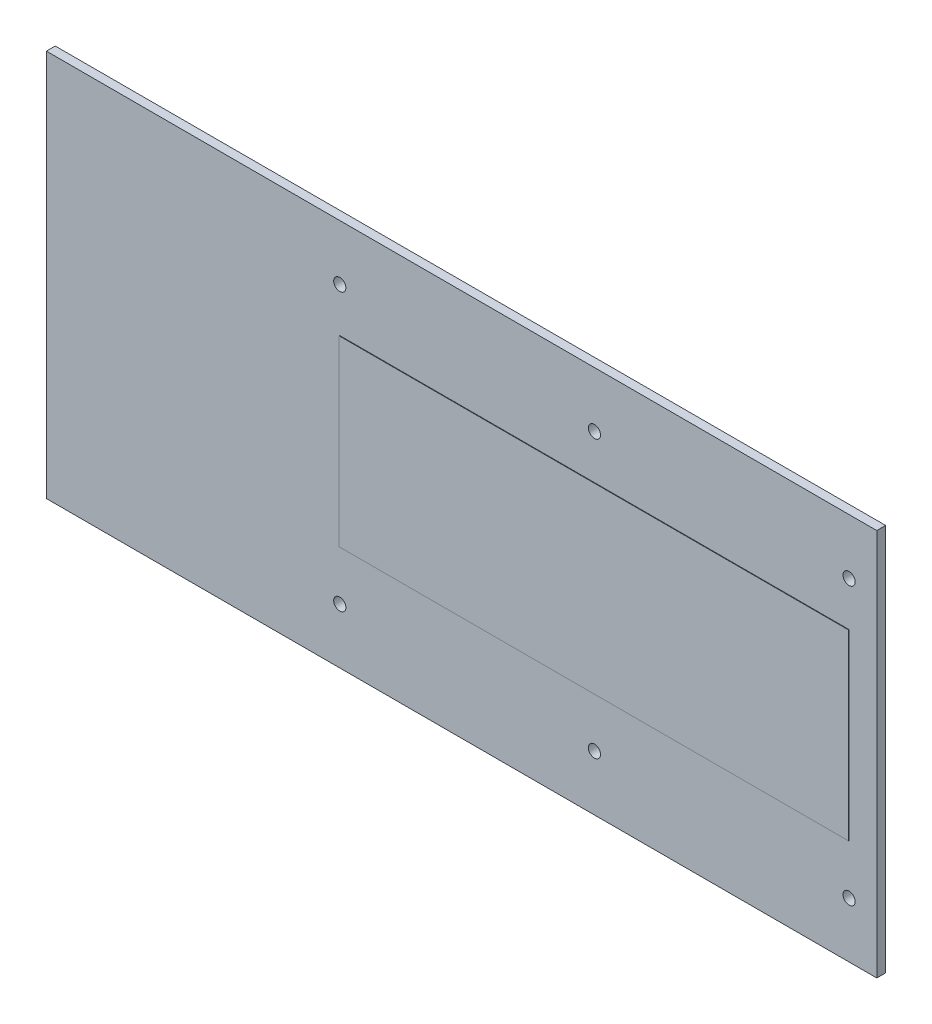
ISO-10303-21;
HEADER;
FILE_DESCRIPTION(('STEP AP214'),'2;1');
FILE_NAME('part.step','',(''),(''),'','','');
FILE_SCHEMA(('AUTOMOTIVE_DESIGN { 1 0 10303 214 1 1 1 1 }'));
ENDSEC;
DATA;
#1=APPLICATION_CONTEXT('core data for automotive mechanical design processes');
#2=APPLICATION_PROTOCOL_DEFINITION('international standard','automotive_design',2000,#1);
#3=PRODUCT_CONTEXT('',#1,'mechanical');
#4=PRODUCT('Part','Part','',(#3));
#5=PRODUCT_RELATED_PRODUCT_CATEGORY('part','',(#4));
#6=PRODUCT_DEFINITION_FORMATION('','',#4);
#7=PRODUCT_DEFINITION_CONTEXT('part definition',#1,'design');
#8=PRODUCT_DEFINITION('design','',#6,#7);
#9=PRODUCT_DEFINITION_SHAPE('','',#8);
#10=(LENGTH_UNIT() NAMED_UNIT(*) SI_UNIT(.MILLI.,.METRE.));
#11=(NAMED_UNIT(*) PLANE_ANGLE_UNIT() SI_UNIT($,.RADIAN.));
#12=(NAMED_UNIT(*) SI_UNIT($,.STERADIAN.) SOLID_ANGLE_UNIT());
#13=UNCERTAINTY_MEASURE_WITH_UNIT(LENGTH_MEASURE(1.E-05),#10,'distance_accuracy_value','');
#14=(GEOMETRIC_REPRESENTATION_CONTEXT(3) GLOBAL_UNCERTAINTY_ASSIGNED_CONTEXT((#13)) GLOBAL_UNIT_ASSIGNED_CONTEXT((#10,
#11,#12)) REPRESENTATION_CONTEXT('',''));
#15=CARTESIAN_POINT('',(0.,0.,0.));
#16=DIRECTION('',(0.,0.,1.));
#17=DIRECTION('',(1.,0.,0.));
#18=AXIS2_PLACEMENT_3D('',#15,#16,#17);
#19=CARTESIAN_POINT('',(53.,52.,1.7));
#20=DIRECTION('',(1.,0.,0.));
#21=DIRECTION('',(0.,0.,-1.));
#22=AXIS2_PLACEMENT_3D('',#19,#20,#21);
#23=PLANE('',#22);
#24=DIRECTION('',(0.,-1.,0.));
#25=VECTOR('',#24,1.);
#26=CARTESIAN_POINT('',(53.,52.,1.6));
#27=LINE('',#26,#25);
#28=CARTESIAN_POINT('',(53.,52.,1.6));
#29=VERTEX_POINT('',#28);
#30=CARTESIAN_POINT('',(53.,19.,1.6));
#31=VERTEX_POINT('',#30);
#32=EDGE_CURVE('E107',#29,#31,#27,.T.);
#33=ORIENTED_EDGE('',*,*,#32,.T.);
#34=DIRECTION('',(0.,0.,-1.));
#35=VECTOR('',#34,1.);
#36=CARTESIAN_POINT('',(53.,19.,1.7));
#37=LINE('',#36,#35);
#38=CARTESIAN_POINT('',(53.,19.,1.7));
#39=VERTEX_POINT('',#38);
#40=EDGE_CURVE('E12',#39,#31,#37,.T.);
#41=ORIENTED_EDGE('',*,*,#40,.F.);
#42=DIRECTION('',(0.,-1.,0.));
#43=VECTOR('',#42,1.);
#44=CARTESIAN_POINT('',(53.,52.,1.7));
#45=LINE('',#44,#43);
#46=CARTESIAN_POINT('',(53.,52.,1.7));
#47=VERTEX_POINT('',#46);
#48=EDGE_CURVE('E95',#47,#39,#45,.T.);
#49=ORIENTED_EDGE('',*,*,#48,.F.);
#50=DIRECTION('',(0.,0.,-1.));
#51=VECTOR('',#50,1.);
#52=CARTESIAN_POINT('',(53.,52.,1.7));
#53=LINE('',#52,#51);
#54=EDGE_CURVE('E103',#47,#29,#53,.T.);
#55=ORIENTED_EDGE('',*,*,#54,.T.);
#56=EDGE_LOOP('',(#33,#41,#49,#55));
#57=FACE_BOUND('',#56,.T.);
#58=ADVANCED_FACE('F44',(#57),#23,.F.);
#59=CARTESIAN_POINT('',(53.,19.,1.7));
#60=DIRECTION('',(0.,1.,0.));
#61=DIRECTION('',(0.,0.,1.));
#62=AXIS2_PLACEMENT_3D('',#59,#60,#61);
#63=PLANE('',#62);
#64=DIRECTION('',(1.,0.,0.));
#65=VECTOR('',#64,1.);
#66=CARTESIAN_POINT('',(53.,19.,1.6));
#67=LINE('',#66,#65);
#68=CARTESIAN_POINT('',(145.,19.,1.6));
#69=VERTEX_POINT('',#68);
#70=EDGE_CURVE('E99',#31,#69,#67,.T.);
#71=ORIENTED_EDGE('',*,*,#70,.T.);
#72=DIRECTION('',(0.,0.,-1.));
#73=VECTOR('',#72,1.);
#74=CARTESIAN_POINT('',(145.,19.,1.7));
#75=LINE('',#74,#73);
#76=CARTESIAN_POINT('',(145.,19.,1.7));
#77=VERTEX_POINT('',#76);
#78=EDGE_CURVE('E52',#77,#69,#75,.T.);
#79=ORIENTED_EDGE('',*,*,#78,.F.);
#80=DIRECTION('',(1.,0.,0.));
#81=VECTOR('',#80,1.);
#82=CARTESIAN_POINT('',(53.,19.,1.7));
#83=LINE('',#82,#81);
#84=EDGE_CURVE('E90',#39,#77,#83,.T.);
#85=ORIENTED_EDGE('',*,*,#84,.F.);
#86=ORIENTED_EDGE('',*,*,#40,.T.);
#87=EDGE_LOOP('',(#71,#79,#85,#86));
#88=FACE_BOUND('',#87,.T.);
#89=ADVANCED_FACE('F98',(#88),#63,.F.);
#90=CARTESIAN_POINT('',(145.,52.,1.7));
#91=DIRECTION('',(-1.,0.,0.));
#92=DIRECTION('',(0.,0.,1.));
#93=AXIS2_PLACEMENT_3D('',#90,#91,#92);
#94=PLANE('',#93);
#95=DIRECTION('',(0.,1.,0.));
#96=VECTOR('',#95,1.);
#97=CARTESIAN_POINT('',(145.,52.,1.6));
#98=LINE('',#97,#96);
#99=CARTESIAN_POINT('',(145.,52.,1.6));
#100=VERTEX_POINT('',#99);
#101=EDGE_CURVE('E77',#69,#100,#98,.T.);
#102=ORIENTED_EDGE('',*,*,#101,.T.);
#103=DIRECTION('',(0.,0.,-1.));
#104=VECTOR('',#103,1.);
#105=CARTESIAN_POINT('',(145.,52.,1.7));
#106=LINE('',#105,#104);
#107=CARTESIAN_POINT('',(145.,52.,1.7));
#108=VERTEX_POINT('',#107);
#109=EDGE_CURVE('E100',#108,#100,#106,.T.);
#110=ORIENTED_EDGE('',*,*,#109,.F.);
#111=DIRECTION('',(0.,1.,0.));
#112=VECTOR('',#111,1.);
#113=CARTESIAN_POINT('',(145.,52.,1.7));
#114=LINE('',#113,#112);
#115=EDGE_CURVE('E93',#77,#108,#114,.T.);
#116=ORIENTED_EDGE('',*,*,#115,.F.);
#117=ORIENTED_EDGE('',*,*,#78,.T.);
#118=EDGE_LOOP('',(#102,#110,#116,#117));
#119=FACE_BOUND('',#118,.T.);
#120=ADVANCED_FACE('F101',(#119),#94,.F.);
#121=CARTESIAN_POINT('',(53.,52.,1.7));
#122=DIRECTION('',(0.,-1.,0.));
#123=DIRECTION('',(0.,0.,-1.));
#124=AXIS2_PLACEMENT_3D('',#121,#122,#123);
#125=PLANE('',#124);
#126=DIRECTION('',(-1.,0.,0.));
#127=VECTOR('',#126,1.);
#128=CARTESIAN_POINT('',(53.,52.,1.6));
#129=LINE('',#128,#127);
#130=EDGE_CURVE('E83',#100,#29,#129,.T.);
#131=ORIENTED_EDGE('',*,*,#130,.T.);
#132=ORIENTED_EDGE('',*,*,#54,.F.);
#133=DIRECTION('',(-1.,0.,0.));
#134=VECTOR('',#133,1.);
#135=CARTESIAN_POINT('',(53.,52.,1.7));
#136=LINE('',#135,#134);
#137=EDGE_CURVE('E60',#108,#47,#136,.T.);
#138=ORIENTED_EDGE('',*,*,#137,.F.);
#139=ORIENTED_EDGE('',*,*,#109,.T.);
#140=EDGE_LOOP('',(#131,#132,#138,#139));
#141=FACE_BOUND('',#140,.T.);
#142=ADVANCED_FACE('F114',(#141),#125,.F.);
#143=CARTESIAN_POINT('',(0.,0.,1.7));
#144=DIRECTION('',(0.,0.,1.));
#145=DIRECTION('',(1.,0.,0.));
#146=AXIS2_PLACEMENT_3D('',#143,#144,#145);
#147=PLANE('',#146);
#148=ORIENTED_EDGE('',*,*,#48,.T.);
#149=ORIENTED_EDGE('',*,*,#84,.T.);
#150=ORIENTED_EDGE('',*,*,#115,.T.);
#151=ORIENTED_EDGE('',*,*,#137,.T.);
#152=EDGE_LOOP('',(#148,#149,#150,#151));
#153=FACE_BOUND('',#152,.T.);
#154=ADVANCED_FACE('F91',(#153),#147,.T.);
#155=CARTESIAN_POINT('',(0.,0.,1.6));
#156=DIRECTION('',(0.,0.,1.));
#157=DIRECTION('',(1.,0.,0.));
#158=AXIS2_PLACEMENT_3D('',#155,#156,#157);
#159=PLANE('',#158);
#160=ORIENTED_EDGE('',*,*,#32,.F.);
#161=ORIENTED_EDGE('',*,*,#130,.F.);
#162=ORIENTED_EDGE('',*,*,#101,.F.);
#163=ORIENTED_EDGE('',*,*,#70,.F.);
#164=EDGE_LOOP('',(#160,#161,#162,#163));
#165=FACE_BOUND('',#164,.T.);
#166=ADVANCED_FACE('F117',(#165),#159,.F.);
#167=CLOSED_SHELL('',(#58,#89,#120,#142,#154,#166));
#168=MANIFOLD_SOLID_BREP('B2',#167);
#169=CARTESIAN_POINT('',(0.,0.,1.6));
#170=DIRECTION('',(0.,0.,-1.));
#171=DIRECTION('',(-1.,0.,0.));
#172=AXIS2_PLACEMENT_3D('',#169,#170,#171);
#173=PLANE('',#172);
#174=CARTESIAN_POINT('',(145.,60.,1.6));
#175=DIRECTION('',(0.,0.,1.));
#176=DIRECTION('',(1.,0.,0.));
#177=AXIS2_PLACEMENT_3D('',#174,#175,#176);
#178=CIRCLE('',#177,1.1);
#179=CARTESIAN_POINT('',(146.1,60.,1.6));
#180=VERTEX_POINT('',#179);
#181=EDGE_CURVE('E268',#180,#180,#178,.T.);
#182=ORIENTED_EDGE('',*,*,#181,.F.);
#183=EDGE_LOOP('',(#182));
#184=FACE_BOUND('',#183,.T.);
#185=CARTESIAN_POINT('',(145.,10.,1.6));
#186=DIRECTION('',(0.,0.,1.));
#187=DIRECTION('',(1.,0.,0.));
#188=AXIS2_PLACEMENT_3D('',#185,#186,#187);
#189=CIRCLE('',#188,1.1);
#190=CARTESIAN_POINT('',(146.1,10.,1.6));
#191=VERTEX_POINT('',#190);
#192=EDGE_CURVE('E274',#191,#191,#189,.T.);
#193=ORIENTED_EDGE('',*,*,#192,.F.);
#194=EDGE_LOOP('',(#193));
#195=FACE_BOUND('',#194,.T.);
#196=CARTESIAN_POINT('',(53.,60.,1.6));
#197=DIRECTION('',(0.,0.,1.));
#198=DIRECTION('',(1.,0.,0.));
#199=AXIS2_PLACEMENT_3D('',#196,#197,#198);
#200=CIRCLE('',#199,1.1);
#201=CARTESIAN_POINT('',(54.1,60.,1.6));
#202=VERTEX_POINT('',#201);
#203=EDGE_CURVE('E280',#202,#202,#200,.T.);
#204=ORIENTED_EDGE('',*,*,#203,.F.);
#205=EDGE_LOOP('',(#204));
#206=FACE_BOUND('',#205,.T.);
#207=CARTESIAN_POINT('',(99.,60.,1.6));
#208=DIRECTION('',(0.,0.,1.));
#209=DIRECTION('',(1.,0.,0.));
#210=AXIS2_PLACEMENT_3D('',#207,#208,#209);
#211=CIRCLE('',#210,1.1);
#212=CARTESIAN_POINT('',(100.1,60.,1.6));
#213=VERTEX_POINT('',#212);
#214=EDGE_CURVE('E286',#213,#213,#211,.T.);
#215=ORIENTED_EDGE('',*,*,#214,.F.);
#216=EDGE_LOOP('',(#215));
#217=FACE_BOUND('',#216,.T.);
#218=CARTESIAN_POINT('',(53.,10.,1.6));
#219=DIRECTION('',(0.,0.,1.));
#220=DIRECTION('',(1.,0.,0.));
#221=AXIS2_PLACEMENT_3D('',#218,#219,#220);
#222=CIRCLE('',#221,1.1);
#223=CARTESIAN_POINT('',(54.1,10.,1.6));
#224=VERTEX_POINT('',#223);
#225=EDGE_CURVE('E292',#224,#224,#222,.T.);
#226=ORIENTED_EDGE('',*,*,#225,.F.);
#227=EDGE_LOOP('',(#226));
#228=FACE_BOUND('',#227,.T.);
#229=CARTESIAN_POINT('',(99.,10.,1.6));
#230=DIRECTION('',(0.,0.,1.));
#231=DIRECTION('',(1.,0.,0.));
#232=AXIS2_PLACEMENT_3D('',#229,#230,#231);
#233=CIRCLE('',#232,1.1);
#234=CARTESIAN_POINT('',(100.1,10.,1.6));
#235=VERTEX_POINT('',#234);
#236=EDGE_CURVE('E298',#235,#235,#233,.T.);
#237=ORIENTED_EDGE('',*,*,#236,.F.);
#238=EDGE_LOOP('',(#237));
#239=FACE_BOUND('',#238,.T.);
#240=DIRECTION('',(-1.,0.,0.));
#241=VECTOR('',#240,1.);
#242=CARTESIAN_POINT('',(0.,70.,1.6));
#243=LINE('',#242,#241);
#244=CARTESIAN_POINT('',(150.,70.,1.6));
#245=VERTEX_POINT('',#244);
#246=CARTESIAN_POINT('',(0.,70.,1.6));
#247=VERTEX_POINT('',#246);
#248=EDGE_CURVE('E304',#245,#247,#243,.T.);
#249=ORIENTED_EDGE('',*,*,#248,.T.);
#250=DIRECTION('',(0.,-1.,0.));
#251=VECTOR('',#250,1.);
#252=CARTESIAN_POINT('',(0.,47.,1.6));
#253=LINE('',#252,#251);
#254=CARTESIAN_POINT('',(0.,0.,1.6));
#255=VERTEX_POINT('',#254);
#256=EDGE_CURVE('E307',#247,#255,#253,.T.);
#257=ORIENTED_EDGE('',*,*,#256,.T.);
#258=DIRECTION('',(1.,0.,0.));
#259=VECTOR('',#258,1.);
#260=CARTESIAN_POINT('',(46.,0.,1.6));
#261=LINE('',#260,#259);
#262=CARTESIAN_POINT('',(150.,0.,1.6));
#263=VERTEX_POINT('',#262);
#264=EDGE_CURVE('E310',#255,#263,#261,.T.);
#265=ORIENTED_EDGE('',*,*,#264,.T.);
#266=DIRECTION('',(0.,1.,0.));
#267=VECTOR('',#266,1.);
#268=CARTESIAN_POINT('',(150.,70.,1.6));
#269=LINE('',#268,#267);
#270=EDGE_CURVE('E312',#263,#245,#269,.T.);
#271=ORIENTED_EDGE('',*,*,#270,.T.);
#272=EDGE_LOOP('',(#249,#257,#265,#271));
#273=FACE_BOUND('',#272,.T.);
#274=DIRECTION('',(1.,0.,0.));
#275=VECTOR('',#274,1.);
#276=CARTESIAN_POINT('',(53.,19.,1.6));
#277=LINE('',#276,#275);
#278=CARTESIAN_POINT('',(53.,19.,1.6));
#279=VERTEX_POINT('',#278);
#280=CARTESIAN_POINT('',(145.,19.,1.6));
#281=VERTEX_POINT('',#280);
#282=EDGE_CURVE('E232',#279,#281,#277,.T.);
#283=ORIENTED_EDGE('',*,*,#282,.F.);
#284=DIRECTION('',(0.,-1.,0.));
#285=VECTOR('',#284,1.);
#286=CARTESIAN_POINT('',(53.,52.,1.6));
#287=LINE('',#286,#285);
#288=CARTESIAN_POINT('',(53.,52.,1.6));
#289=VERTEX_POINT('',#288);
#290=EDGE_CURVE('E254',#289,#279,#287,.T.);
#291=ORIENTED_EDGE('',*,*,#290,.F.);
#292=DIRECTION('',(-1.,0.,0.));
#293=VECTOR('',#292,1.);
#294=CARTESIAN_POINT('',(145.,52.,1.6));
#295=LINE('',#294,#293);
#296=CARTESIAN_POINT('',(145.,52.,1.6));
#297=VERTEX_POINT('',#296);
#298=EDGE_CURVE('E252',#297,#289,#295,.T.);
#299=ORIENTED_EDGE('',*,*,#298,.F.);
#300=DIRECTION('',(0.,1.,0.));
#301=VECTOR('',#300,1.);
#302=CARTESIAN_POINT('',(145.,19.,1.6));
#303=LINE('',#302,#301);
#304=EDGE_CURVE('E240',#281,#297,#303,.T.);
#305=ORIENTED_EDGE('',*,*,#304,.F.);
#306=EDGE_LOOP('',(#283,#291,#299,#305));
#307=FACE_BOUND('',#306,.T.);
#308=ADVANCED_FACE('F167',(#184,#195,#206,#217,#228,#239,#273,#307),#173,.F.);
#309=CARTESIAN_POINT('',(0.,0.,0.));
#310=DIRECTION('',(0.,0.,-1.));
#311=DIRECTION('',(-1.,0.,0.));
#312=AXIS2_PLACEMENT_3D('',#309,#310,#311);
#313=PLANE('',#312);
#314=CARTESIAN_POINT('',(145.,10.,0.));
#315=DIRECTION('',(0.,0.,1.));
#316=DIRECTION('',(1.,0.,0.));
#317=AXIS2_PLACEMENT_3D('',#314,#315,#316);
#318=CIRCLE('',#317,1.1);
#319=CARTESIAN_POINT('',(146.1,10.,0.));
#320=VERTEX_POINT('',#319);
#321=EDGE_CURVE('E271',#320,#320,#318,.T.);
#322=ORIENTED_EDGE('',*,*,#321,.T.);
#323=EDGE_LOOP('',(#322));
#324=FACE_BOUND('',#323,.T.);
#325=CARTESIAN_POINT('',(99.,60.,0.));
#326=DIRECTION('',(0.,0.,1.));
#327=DIRECTION('',(1.,0.,0.));
#328=AXIS2_PLACEMENT_3D('',#325,#326,#327);
#329=CIRCLE('',#328,1.1);
#330=CARTESIAN_POINT('',(100.1,60.,0.));
#331=VERTEX_POINT('',#330);
#332=EDGE_CURVE('E283',#331,#331,#329,.T.);
#333=ORIENTED_EDGE('',*,*,#332,.T.);
#334=EDGE_LOOP('',(#333));
#335=FACE_BOUND('',#334,.T.);
#336=CARTESIAN_POINT('',(99.,10.,0.));
#337=DIRECTION('',(0.,0.,1.));
#338=DIRECTION('',(1.,0.,0.));
#339=AXIS2_PLACEMENT_3D('',#336,#337,#338);
#340=CIRCLE('',#339,1.1);
#341=CARTESIAN_POINT('',(100.1,10.,0.));
#342=VERTEX_POINT('',#341);
#343=EDGE_CURVE('E295',#342,#342,#340,.T.);
#344=ORIENTED_EDGE('',*,*,#343,.T.);
#345=EDGE_LOOP('',(#344));
#346=FACE_BOUND('',#345,.T.);
#347=DIRECTION('',(0.,-1.,0.));
#348=VECTOR('',#347,1.);
#349=CARTESIAN_POINT('',(0.,0.,0.));
#350=LINE('',#349,#348);
#351=CARTESIAN_POINT('',(0.,70.,0.));
#352=VERTEX_POINT('',#351);
#353=CARTESIAN_POINT('',(0.,0.,0.));
#354=VERTEX_POINT('',#353);
#355=EDGE_CURVE('E301',#352,#354,#350,.T.);
#356=ORIENTED_EDGE('',*,*,#355,.F.);
#357=DIRECTION('',(-1.,0.,0.));
#358=VECTOR('',#357,1.);
#359=CARTESIAN_POINT('',(48.,70.,0.));
#360=LINE('',#359,#358);
#361=CARTESIAN_POINT('',(150.,70.,0.));
#362=VERTEX_POINT('',#361);
#363=EDGE_CURVE('E308',#362,#352,#360,.T.);
#364=ORIENTED_EDGE('',*,*,#363,.F.);
#365=DIRECTION('',(0.,1.,0.));
#366=VECTOR('',#365,1.);
#367=CARTESIAN_POINT('',(150.,70.,0.));
#368=LINE('',#367,#366);
#369=CARTESIAN_POINT('',(150.,0.,0.));
#370=VERTEX_POINT('',#369);
#371=EDGE_CURVE('E320',#370,#362,#368,.T.);
#372=ORIENTED_EDGE('',*,*,#371,.F.);
#373=DIRECTION('',(1.,0.,0.));
#374=VECTOR('',#373,1.);
#375=CARTESIAN_POINT('',(150.,0.,0.));
#376=LINE('',#375,#374);
#377=EDGE_CURVE('E318',#354,#370,#376,.T.);
#378=ORIENTED_EDGE('',*,*,#377,.F.);
#379=EDGE_LOOP('',(#356,#364,#372,#378));
#380=FACE_BOUND('',#379,.T.);
#381=CARTESIAN_POINT('',(53.,10.,0.));
#382=DIRECTION('',(0.,0.,1.));
#383=DIRECTION('',(1.,0.,0.));
#384=AXIS2_PLACEMENT_3D('',#381,#382,#383);
#385=CIRCLE('',#384,1.1);
#386=CARTESIAN_POINT('',(54.1,10.,0.));
#387=VERTEX_POINT('',#386);
#388=EDGE_CURVE('E289',#387,#387,#385,.T.);
#389=ORIENTED_EDGE('',*,*,#388,.T.);
#390=EDGE_LOOP('',(#389));
#391=FACE_BOUND('',#390,.T.);
#392=CARTESIAN_POINT('',(53.,60.,0.));
#393=DIRECTION('',(0.,0.,1.));
#394=DIRECTION('',(1.,0.,0.));
#395=AXIS2_PLACEMENT_3D('',#392,#393,#394);
#396=CIRCLE('',#395,1.1);
#397=CARTESIAN_POINT('',(54.1,60.,0.));
#398=VERTEX_POINT('',#397);
#399=EDGE_CURVE('E277',#398,#398,#396,.T.);
#400=ORIENTED_EDGE('',*,*,#399,.T.);
#401=EDGE_LOOP('',(#400));
#402=FACE_BOUND('',#401,.T.);
#403=CARTESIAN_POINT('',(145.,60.,0.));
#404=DIRECTION('',(0.,0.,1.));
#405=DIRECTION('',(1.,0.,0.));
#406=AXIS2_PLACEMENT_3D('',#403,#404,#405);
#407=CIRCLE('',#406,1.1);
#408=CARTESIAN_POINT('',(146.1,60.,0.));
#409=VERTEX_POINT('',#408);
#410=EDGE_CURVE('E248',#409,#409,#407,.T.);
#411=ORIENTED_EDGE('',*,*,#410,.T.);
#412=EDGE_LOOP('',(#411));
#413=FACE_BOUND('',#412,.T.);
#414=DIRECTION('',(0.,-1.,0.));
#415=VECTOR('',#414,1.);
#416=CARTESIAN_POINT('',(53.,52.,0.));
#417=LINE('',#416,#415);
#418=CARTESIAN_POINT('',(53.,52.,0.));
#419=VERTEX_POINT('',#418);
#420=CARTESIAN_POINT('',(53.,19.,0.));
#421=VERTEX_POINT('',#420);
#422=EDGE_CURVE('E241',#419,#421,#417,.T.);
#423=ORIENTED_EDGE('',*,*,#422,.T.);
#424=DIRECTION('',(1.,0.,0.));
#425=VECTOR('',#424,1.);
#426=CARTESIAN_POINT('',(53.,19.,0.));
#427=LINE('',#426,#425);
#428=CARTESIAN_POINT('',(145.,19.,0.));
#429=VERTEX_POINT('',#428);
#430=EDGE_CURVE('E190',#421,#429,#427,.T.);
#431=ORIENTED_EDGE('',*,*,#430,.T.);
#432=DIRECTION('',(0.,1.,0.));
#433=VECTOR('',#432,1.);
#434=CARTESIAN_POINT('',(145.,19.,0.));
#435=LINE('',#434,#433);
#436=CARTESIAN_POINT('',(145.,52.,0.));
#437=VERTEX_POINT('',#436);
#438=EDGE_CURVE('E247',#429,#437,#435,.T.);
#439=ORIENTED_EDGE('',*,*,#438,.T.);
#440=DIRECTION('',(-1.,0.,0.));
#441=VECTOR('',#440,1.);
#442=CARTESIAN_POINT('',(145.,52.,0.));
#443=LINE('',#442,#441);
#444=EDGE_CURVE('E260',#437,#419,#443,.T.);
#445=ORIENTED_EDGE('',*,*,#444,.T.);
#446=EDGE_LOOP('',(#423,#431,#439,#445));
#447=FACE_BOUND('',#446,.T.);
#448=ADVANCED_FACE('F338',(#324,#335,#346,#380,#391,#402,#413,#447),#313,.T.);
#449=CARTESIAN_POINT('',(0.,0.,1.6));
#450=DIRECTION('',(1.,0.,0.));
#451=DIRECTION('',(0.,0.,-1.));
#452=AXIS2_PLACEMENT_3D('',#449,#450,#451);
#453=PLANE('',#452);
#454=ORIENTED_EDGE('',*,*,#355,.T.);
#455=DIRECTION('',(0.,0.,-1.));
#456=VECTOR('',#455,1.);
#457=CARTESIAN_POINT('',(0.,0.,1.6));
#458=LINE('',#457,#456);
#459=EDGE_CURVE('E175',#255,#354,#458,.T.);
#460=ORIENTED_EDGE('',*,*,#459,.F.);
#461=ORIENTED_EDGE('',*,*,#256,.F.);
#462=DIRECTION('',(0.,0.,-1.));
#463=VECTOR('',#462,1.);
#464=CARTESIAN_POINT('',(0.,70.,1.6));
#465=LINE('',#464,#463);
#466=EDGE_CURVE('E42',#247,#352,#465,.T.);
#467=ORIENTED_EDGE('',*,*,#466,.T.);
#468=EDGE_LOOP('',(#454,#460,#461,#467));
#469=FACE_BOUND('',#468,.T.);
#470=ADVANCED_FACE('F169',(#469),#453,.F.);
#471=CARTESIAN_POINT('',(150.,0.,1.6));
#472=DIRECTION('',(0.,1.,0.));
#473=DIRECTION('',(0.,0.,1.));
#474=AXIS2_PLACEMENT_3D('',#471,#472,#473);
#475=PLANE('',#474);
#476=ORIENTED_EDGE('',*,*,#377,.T.);
#477=DIRECTION('',(0.,0.,-1.));
#478=VECTOR('',#477,1.);
#479=CARTESIAN_POINT('',(150.,0.,1.6));
#480=LINE('',#479,#478);
#481=EDGE_CURVE('E326',#263,#370,#480,.T.);
#482=ORIENTED_EDGE('',*,*,#481,.F.);
#483=ORIENTED_EDGE('',*,*,#264,.F.);
#484=ORIENTED_EDGE('',*,*,#459,.T.);
#485=EDGE_LOOP('',(#476,#482,#483,#484));
#486=FACE_BOUND('',#485,.T.);
#487=ADVANCED_FACE('F332',(#486),#475,.F.);
#488=CARTESIAN_POINT('',(150.,70.,1.6));
#489=DIRECTION('',(-1.,0.,0.));
#490=DIRECTION('',(0.,0.,1.));
#491=AXIS2_PLACEMENT_3D('',#488,#489,#490);
#492=PLANE('',#491);
#493=ORIENTED_EDGE('',*,*,#371,.T.);
#494=DIRECTION('',(0.,0.,-1.));
#495=VECTOR('',#494,1.);
#496=CARTESIAN_POINT('',(150.,70.,1.6));
#497=LINE('',#496,#495);
#498=EDGE_CURVE('E315',#245,#362,#497,.T.);
#499=ORIENTED_EDGE('',*,*,#498,.F.);
#500=ORIENTED_EDGE('',*,*,#270,.F.);
#501=ORIENTED_EDGE('',*,*,#481,.T.);
#502=EDGE_LOOP('',(#493,#499,#500,#501));
#503=FACE_BOUND('',#502,.T.);
#504=ADVANCED_FACE('F346',(#503),#492,.F.);
#505=CARTESIAN_POINT('',(48.,70.,1.6));
#506=DIRECTION('',(0.,-1.,0.));
#507=DIRECTION('',(0.,0.,-1.));
#508=AXIS2_PLACEMENT_3D('',#505,#506,#507);
#509=PLANE('',#508);
#510=ORIENTED_EDGE('',*,*,#363,.T.);
#511=ORIENTED_EDGE('',*,*,#466,.F.);
#512=ORIENTED_EDGE('',*,*,#248,.F.);
#513=ORIENTED_EDGE('',*,*,#498,.T.);
#514=EDGE_LOOP('',(#510,#511,#512,#513));
#515=FACE_BOUND('',#514,.T.);
#516=ADVANCED_FACE('F342',(#515),#509,.F.);
#517=CARTESIAN_POINT('',(99.,10.,1.6));
#518=DIRECTION('',(0.,0.,-1.));
#519=DIRECTION('',(-1.,0.,0.));
#520=AXIS2_PLACEMENT_3D('',#517,#518,#519);
#521=CYLINDRICAL_SURFACE('',#520,1.1);
#522=ORIENTED_EDGE('',*,*,#343,.F.);
#523=EDGE_LOOP('',(#522));
#524=FACE_BOUND('',#523,.T.);
#525=ORIENTED_EDGE('',*,*,#236,.T.);
#526=EDGE_LOOP('',(#525));
#527=FACE_BOUND('',#526,.T.);
#528=ADVANCED_FACE('F359',(#524,#527),#521,.F.);
#529=CARTESIAN_POINT('',(53.,10.,1.6));
#530=DIRECTION('',(0.,0.,-1.));
#531=DIRECTION('',(-1.,0.,0.));
#532=AXIS2_PLACEMENT_3D('',#529,#530,#531);
#533=CYLINDRICAL_SURFACE('',#532,1.1);
#534=ORIENTED_EDGE('',*,*,#388,.F.);
#535=EDGE_LOOP('',(#534));
#536=FACE_BOUND('',#535,.T.);
#537=ORIENTED_EDGE('',*,*,#225,.T.);
#538=EDGE_LOOP('',(#537));
#539=FACE_BOUND('',#538,.T.);
#540=ADVANCED_FACE('F432',(#536,#539),#533,.F.);
#541=CARTESIAN_POINT('',(99.,60.,1.6));
#542=DIRECTION('',(0.,0.,-1.));
#543=DIRECTION('',(-1.,0.,0.));
#544=AXIS2_PLACEMENT_3D('',#541,#542,#543);
#545=CYLINDRICAL_SURFACE('',#544,1.1);
#546=ORIENTED_EDGE('',*,*,#332,.F.);
#547=EDGE_LOOP('',(#546));
#548=FACE_BOUND('',#547,.T.);
#549=ORIENTED_EDGE('',*,*,#214,.T.);
#550=EDGE_LOOP('',(#549));
#551=FACE_BOUND('',#550,.T.);
#552=ADVANCED_FACE('F443',(#548,#551),#545,.F.);
#553=CARTESIAN_POINT('',(53.,60.,1.6));
#554=DIRECTION('',(0.,0.,-1.));
#555=DIRECTION('',(-1.,0.,0.));
#556=AXIS2_PLACEMENT_3D('',#553,#554,#555);
#557=CYLINDRICAL_SURFACE('',#556,1.1);
#558=ORIENTED_EDGE('',*,*,#399,.F.);
#559=EDGE_LOOP('',(#558));
#560=FACE_BOUND('',#559,.T.);
#561=ORIENTED_EDGE('',*,*,#203,.T.);
#562=EDGE_LOOP('',(#561));
#563=FACE_BOUND('',#562,.T.);
#564=ADVANCED_FACE('F454',(#560,#563),#557,.F.);
#565=CARTESIAN_POINT('',(145.,10.,1.6));
#566=DIRECTION('',(0.,0.,-1.));
#567=DIRECTION('',(-1.,0.,0.));
#568=AXIS2_PLACEMENT_3D('',#565,#566,#567);
#569=CYLINDRICAL_SURFACE('',#568,1.1);
#570=ORIENTED_EDGE('',*,*,#321,.F.);
#571=EDGE_LOOP('',(#570));
#572=FACE_BOUND('',#571,.T.);
#573=ORIENTED_EDGE('',*,*,#192,.T.);
#574=EDGE_LOOP('',(#573));
#575=FACE_BOUND('',#574,.T.);
#576=ADVANCED_FACE('F466',(#572,#575),#569,.F.);
#577=CARTESIAN_POINT('',(145.,60.,1.6));
#578=DIRECTION('',(0.,0.,-1.));
#579=DIRECTION('',(-1.,0.,0.));
#580=AXIS2_PLACEMENT_3D('',#577,#578,#579);
#581=CYLINDRICAL_SURFACE('',#580,1.1);
#582=ORIENTED_EDGE('',*,*,#410,.F.);
#583=EDGE_LOOP('',(#582));
#584=FACE_BOUND('',#583,.T.);
#585=ORIENTED_EDGE('',*,*,#181,.T.);
#586=EDGE_LOOP('',(#585));
#587=FACE_BOUND('',#586,.T.);
#588=ADVANCED_FACE('F478',(#584,#587),#581,.F.);
#589=CARTESIAN_POINT('',(53.,19.,1.6));
#590=DIRECTION('',(0.,1.,0.));
#591=DIRECTION('',(0.,0.,1.));
#592=AXIS2_PLACEMENT_3D('',#589,#590,#591);
#593=PLANE('',#592);
#594=ORIENTED_EDGE('',*,*,#430,.F.);
#595=DIRECTION('',(0.,0.,-1.));
#596=VECTOR('',#595,1.);
#597=CARTESIAN_POINT('',(53.,19.,1.6));
#598=LINE('',#597,#596);
#599=EDGE_CURVE('E236',#279,#421,#598,.T.);
#600=ORIENTED_EDGE('',*,*,#599,.F.);
#601=ORIENTED_EDGE('',*,*,#282,.T.);
#602=DIRECTION('',(0.,0.,-1.));
#603=VECTOR('',#602,1.);
#604=CARTESIAN_POINT('',(145.,19.,1.6));
#605=LINE('',#604,#603);
#606=EDGE_CURVE('E235',#281,#429,#605,.T.);
#607=ORIENTED_EDGE('',*,*,#606,.T.);
#608=EDGE_LOOP('',(#594,#600,#601,#607));
#609=FACE_BOUND('',#608,.T.);
#610=ADVANCED_FACE('F234',(#609),#593,.T.);
#611=CARTESIAN_POINT('',(145.,19.,1.6));
#612=DIRECTION('',(-1.,0.,0.));
#613=DIRECTION('',(0.,0.,1.));
#614=AXIS2_PLACEMENT_3D('',#611,#612,#613);
#615=PLANE('',#614);
#616=ORIENTED_EDGE('',*,*,#438,.F.);
#617=ORIENTED_EDGE('',*,*,#606,.F.);
#618=ORIENTED_EDGE('',*,*,#304,.T.);
#619=DIRECTION('',(0.,0.,-1.));
#620=VECTOR('',#619,1.);
#621=CARTESIAN_POINT('',(145.,52.,1.6));
#622=LINE('',#621,#620);
#623=EDGE_CURVE('E249',#297,#437,#622,.T.);
#624=ORIENTED_EDGE('',*,*,#623,.T.);
#625=EDGE_LOOP('',(#616,#617,#618,#624));
#626=FACE_BOUND('',#625,.T.);
#627=ADVANCED_FACE('F244',(#626),#615,.T.);
#628=CARTESIAN_POINT('',(145.,52.,1.6));
#629=DIRECTION('',(0.,-1.,0.));
#630=DIRECTION('',(0.,0.,-1.));
#631=AXIS2_PLACEMENT_3D('',#628,#629,#630);
#632=PLANE('',#631);
#633=ORIENTED_EDGE('',*,*,#444,.F.);
#634=ORIENTED_EDGE('',*,*,#623,.F.);
#635=ORIENTED_EDGE('',*,*,#298,.T.);
#636=DIRECTION('',(0.,0.,-1.));
#637=VECTOR('',#636,1.);
#638=CARTESIAN_POINT('',(53.,52.,1.6));
#639=LINE('',#638,#637);
#640=EDGE_CURVE('E182',#289,#419,#639,.T.);
#641=ORIENTED_EDGE('',*,*,#640,.T.);
#642=EDGE_LOOP('',(#633,#634,#635,#641));
#643=FACE_BOUND('',#642,.T.);
#644=ADVANCED_FACE('F508',(#643),#632,.T.);
#645=CARTESIAN_POINT('',(53.,52.,1.6));
#646=DIRECTION('',(1.,0.,0.));
#647=DIRECTION('',(0.,0.,-1.));
#648=AXIS2_PLACEMENT_3D('',#645,#646,#647);
#649=PLANE('',#648);
#650=ORIENTED_EDGE('',*,*,#422,.F.);
#651=ORIENTED_EDGE('',*,*,#640,.F.);
#652=ORIENTED_EDGE('',*,*,#290,.T.);
#653=ORIENTED_EDGE('',*,*,#599,.T.);
#654=EDGE_LOOP('',(#650,#651,#652,#653));
#655=FACE_BOUND('',#654,.T.);
#656=ADVANCED_FACE('F516',(#655),#649,.T.);
#657=CLOSED_SHELL('',(#308,#448,#470,#487,#504,#516,#528,#540,#552,#564,#576,#588,#610,#627,
#644,#656));
#658=MANIFOLD_SOLID_BREP('B6',#657);
#659=ADVANCED_BREP_SHAPE_REPRESENTATION('',(#18,#168,#658),#14);
#660=SHAPE_DEFINITION_REPRESENTATION(#9,#659);
ENDSEC;
END-ISO-10303-21;
